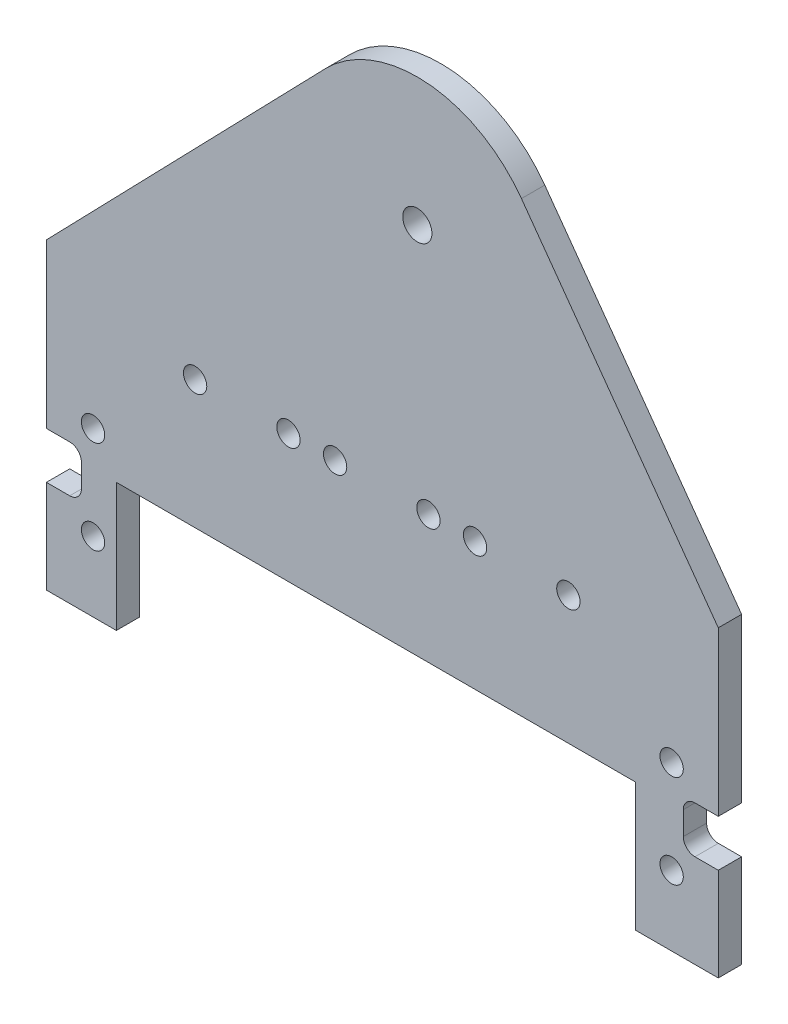
ISO-10303-21;
HEADER;
FILE_DESCRIPTION(('STEP AP214'),'2;1');
FILE_NAME('part.step','',(''),(''),'','','');
FILE_SCHEMA(('AUTOMOTIVE_DESIGN { 1 0 10303 214 1 1 1 1 }'));
ENDSEC;
DATA;
#1=APPLICATION_CONTEXT('core data for automotive mechanical design processes');
#2=APPLICATION_PROTOCOL_DEFINITION('international standard','automotive_design',2000,#1);
#3=PRODUCT_CONTEXT('',#1,'mechanical');
#4=PRODUCT('Part','Part','',(#3));
#5=PRODUCT_RELATED_PRODUCT_CATEGORY('part','',(#4));
#6=PRODUCT_DEFINITION_FORMATION('','',#4);
#7=PRODUCT_DEFINITION_CONTEXT('part definition',#1,'design');
#8=PRODUCT_DEFINITION('design','',#6,#7);
#9=PRODUCT_DEFINITION_SHAPE('','',#8);
#10=(LENGTH_UNIT() NAMED_UNIT(*) SI_UNIT(.MILLI.,.METRE.));
#11=(NAMED_UNIT(*) PLANE_ANGLE_UNIT() SI_UNIT($,.RADIAN.));
#12=(NAMED_UNIT(*) SI_UNIT($,.STERADIAN.) SOLID_ANGLE_UNIT());
#13=UNCERTAINTY_MEASURE_WITH_UNIT(LENGTH_MEASURE(1.E-05),#10,'distance_accuracy_value','');
#14=(GEOMETRIC_REPRESENTATION_CONTEXT(3) GLOBAL_UNCERTAINTY_ASSIGNED_CONTEXT((#13)) GLOBAL_UNIT_ASSIGNED_CONTEXT((#10,
#11,#12)) REPRESENTATION_CONTEXT('',''));
#15=CARTESIAN_POINT('',(0.,0.,0.));
#16=DIRECTION('',(0.,0.,1.));
#17=DIRECTION('',(1.,0.,0.));
#18=AXIS2_PLACEMENT_3D('',#15,#16,#17);
#19=CARTESIAN_POINT('',(-29.8,-32.,2.));
#20=DIRECTION('',(0.,0.,-1.));
#21=DIRECTION('',(-1.,0.,0.));
#22=AXIS2_PLACEMENT_3D('',#19,#20,#21);
#23=PLANE('',#22);
#24=DIRECTION('',(0.,-1.,0.));
#25=VECTOR('',#24,1.);
#26=CARTESIAN_POINT('',(-31.8,-18.,2.));
#27=LINE('',#26,#25);
#28=CARTESIAN_POINT('',(-31.8,-17.,2.));
#29=VERTEX_POINT('',#28);
#30=CARTESIAN_POINT('',(-31.8,-31.,2.));
#31=VERTEX_POINT('',#30);
#32=EDGE_CURVE('E49',#29,#31,#27,.T.);
#33=ORIENTED_EDGE('',*,*,#32,.T.);
#34=DIRECTION('',(1.,0.,0.));
#35=VECTOR('',#34,1.);
#36=CARTESIAN_POINT('',(-31.8,-31.,2.));
#37=LINE('',#36,#35);
#38=CARTESIAN_POINT('',(-29.8,-31.,2.));
#39=VERTEX_POINT('',#38);
#40=EDGE_CURVE('E135',#31,#39,#37,.T.);
#41=ORIENTED_EDGE('',*,*,#40,.T.);
#42=CARTESIAN_POINT('',(-29.8,-32.,2.));
#43=DIRECTION('',(0.,0.,-1.));
#44=DIRECTION('',(-1.,0.,0.));
#45=AXIS2_PLACEMENT_3D('',#42,#43,#44);
#46=CIRCLE('',#45,1.);
#47=CARTESIAN_POINT('',(-28.8,-32.,2.));
#48=VERTEX_POINT('',#47);
#49=EDGE_CURVE('E320',#39,#48,#46,.T.);
#50=ORIENTED_EDGE('',*,*,#49,.T.);
#51=DIRECTION('',(0.,-1.,0.));
#52=VECTOR('',#51,1.);
#53=CARTESIAN_POINT('',(-28.8,-32.,2.));
#54=LINE('',#53,#52);
#55=CARTESIAN_POINT('',(-28.8,-34.,2.));
#56=VERTEX_POINT('',#55);
#57=EDGE_CURVE('E340',#48,#56,#54,.T.);
#58=ORIENTED_EDGE('',*,*,#57,.T.);
#59=CARTESIAN_POINT('',(-29.8,-34.,2.));
#60=DIRECTION('',(0.,0.,-1.));
#61=DIRECTION('',(-1.,0.,0.));
#62=AXIS2_PLACEMENT_3D('',#59,#60,#61);
#63=CIRCLE('',#62,1.);
#64=CARTESIAN_POINT('',(-29.8,-35.,2.));
#65=VERTEX_POINT('',#64);
#66=EDGE_CURVE('E337',#56,#65,#63,.T.);
#67=ORIENTED_EDGE('',*,*,#66,.T.);
#68=DIRECTION('',(-1.,0.,0.));
#69=VECTOR('',#68,1.);
#70=CARTESIAN_POINT('',(-31.8,-35.,2.));
#71=LINE('',#70,#69);
#72=CARTESIAN_POINT('',(-31.8,-35.,2.));
#73=VERTEX_POINT('',#72);
#74=EDGE_CURVE('E339',#65,#73,#71,.T.);
#75=ORIENTED_EDGE('',*,*,#74,.T.);
#76=DIRECTION('',(0.,-1.,0.));
#77=VECTOR('',#76,1.);
#78=CARTESIAN_POINT('',(-31.8,-35.,2.));
#79=LINE('',#78,#77);
#80=CARTESIAN_POINT('',(-31.8,-43.,2.));
#81=VERTEX_POINT('',#80);
#82=EDGE_CURVE('E342',#73,#81,#79,.T.);
#83=ORIENTED_EDGE('',*,*,#82,.T.);
#84=DIRECTION('',(1.,0.,0.));
#85=VECTOR('',#84,1.);
#86=CARTESIAN_POINT('',(-31.8,-43.,2.));
#87=LINE('',#86,#85);
#88=CARTESIAN_POINT('',(-25.8,-43.,2.));
#89=VERTEX_POINT('',#88);
#90=EDGE_CURVE('E348',#81,#89,#87,.T.);
#91=ORIENTED_EDGE('',*,*,#90,.T.);
#92=DIRECTION('',(0.,1.,0.));
#93=VECTOR('',#92,1.);
#94=CARTESIAN_POINT('',(-25.8,-32.,2.));
#95=LINE('',#94,#93);
#96=CARTESIAN_POINT('',(-25.8,-32.,2.));
#97=VERTEX_POINT('',#96);
#98=EDGE_CURVE('E350',#89,#97,#95,.T.);
#99=ORIENTED_EDGE('',*,*,#98,.T.);
#100=DIRECTION('',(1.,0.,0.));
#101=VECTOR('',#100,1.);
#102=CARTESIAN_POINT('',(-25.8,-32.,2.));
#103=LINE('',#102,#101);
#104=CARTESIAN_POINT('',(18.7,-32.,2.));
#105=VERTEX_POINT('',#104);
#106=EDGE_CURVE('E352',#97,#105,#103,.T.);
#107=ORIENTED_EDGE('',*,*,#106,.T.);
#108=DIRECTION('',(0.,-1.,0.));
#109=VECTOR('',#108,1.);
#110=CARTESIAN_POINT('',(18.7,-43.,2.));
#111=LINE('',#110,#109);
#112=CARTESIAN_POINT('',(18.7,-43.,2.));
#113=VERTEX_POINT('',#112);
#114=EDGE_CURVE('E354',#105,#113,#111,.T.);
#115=ORIENTED_EDGE('',*,*,#114,.T.);
#116=DIRECTION('',(1.,0.,0.));
#117=VECTOR('',#116,1.);
#118=CARTESIAN_POINT('',(18.7,-43.,2.));
#119=LINE('',#118,#117);
#120=CARTESIAN_POINT('',(25.8,-43.,2.));
#121=VERTEX_POINT('',#120);
#122=EDGE_CURVE('E356',#113,#121,#119,.T.);
#123=ORIENTED_EDGE('',*,*,#122,.T.);
#124=DIRECTION('',(0.,1.,0.));
#125=VECTOR('',#124,1.);
#126=CARTESIAN_POINT('',(25.8,-42.,2.));
#127=LINE('',#126,#125);
#128=CARTESIAN_POINT('',(25.8,-35.,2.));
#129=VERTEX_POINT('',#128);
#130=EDGE_CURVE('E358',#121,#129,#127,.T.);
#131=ORIENTED_EDGE('',*,*,#130,.T.);
#132=DIRECTION('',(-1.,0.,0.));
#133=VECTOR('',#132,1.);
#134=CARTESIAN_POINT('',(25.8,-35.,2.));
#135=LINE('',#134,#133);
#136=CARTESIAN_POINT('',(23.8,-35.,2.));
#137=VERTEX_POINT('',#136);
#138=EDGE_CURVE('E360',#129,#137,#135,.T.);
#139=ORIENTED_EDGE('',*,*,#138,.T.);
#140=CARTESIAN_POINT('',(23.8,-34.,2.));
#141=DIRECTION('',(0.,0.,-1.));
#142=DIRECTION('',(1.,0.,0.));
#143=AXIS2_PLACEMENT_3D('',#140,#141,#142);
#144=CIRCLE('',#143,1.);
#145=CARTESIAN_POINT('',(22.8,-34.,2.));
#146=VERTEX_POINT('',#145);
#147=EDGE_CURVE('E362',#137,#146,#144,.T.);
#148=ORIENTED_EDGE('',*,*,#147,.T.);
#149=DIRECTION('',(0.,1.,0.));
#150=VECTOR('',#149,1.);
#151=CARTESIAN_POINT('',(22.8,-32.,2.));
#152=LINE('',#151,#150);
#153=CARTESIAN_POINT('',(22.8,-32.,2.));
#154=VERTEX_POINT('',#153);
#155=EDGE_CURVE('E364',#146,#154,#152,.T.);
#156=ORIENTED_EDGE('',*,*,#155,.T.);
#157=CARTESIAN_POINT('',(23.8,-32.,2.));
#158=DIRECTION('',(0.,0.,-1.));
#159=DIRECTION('',(1.,0.,0.));
#160=AXIS2_PLACEMENT_3D('',#157,#158,#159);
#161=CIRCLE('',#160,1.);
#162=CARTESIAN_POINT('',(23.8,-31.,2.));
#163=VERTEX_POINT('',#162);
#164=EDGE_CURVE('E366',#154,#163,#161,.T.);
#165=ORIENTED_EDGE('',*,*,#164,.T.);
#166=DIRECTION('',(1.,0.,0.));
#167=VECTOR('',#166,1.);
#168=CARTESIAN_POINT('',(25.8,-31.,2.));
#169=LINE('',#168,#167);
#170=CARTESIAN_POINT('',(25.8,-31.,2.));
#171=VERTEX_POINT('',#170);
#172=EDGE_CURVE('E368',#163,#171,#169,.T.);
#173=ORIENTED_EDGE('',*,*,#172,.T.);
#174=DIRECTION('',(0.,1.,0.));
#175=VECTOR('',#174,1.);
#176=CARTESIAN_POINT('',(25.8,-18.,2.));
#177=LINE('',#176,#175);
#178=CARTESIAN_POINT('',(25.8,-17.,2.));
#179=VERTEX_POINT('',#178);
#180=EDGE_CURVE('E197',#171,#179,#177,.T.);
#181=ORIENTED_EDGE('',*,*,#180,.T.);
#182=DIRECTION('',(-0.584428553705234,0.811445171046084,0.));
#183=VECTOR('',#182,1.);
#184=CARTESIAN_POINT('',(25.8,-17.,2.));
#185=LINE('',#184,#183);
#186=CARTESIAN_POINT('',(8.92589688150692,6.42871409075757,2.));
#187=VERTEX_POINT('',#186);
#188=EDGE_CURVE('E191',#179,#187,#185,.T.);
#189=ORIENTED_EDGE('',*,*,#188,.T.);
#190=CARTESIAN_POINT('',(0.,0.,2.));
#191=DIRECTION('',(0.,0.,1.));
#192=DIRECTION('',(1.,0.,0.));
#193=AXIS2_PLACEMENT_3D('',#190,#191,#192);
#194=CIRCLE('',#193,11.);
#195=CARTESIAN_POINT('',(-7.89807418644776,7.65639759582582,2.));
#196=VERTEX_POINT('',#195);
#197=EDGE_CURVE('E195',#187,#196,#194,.T.);
#198=ORIENTED_EDGE('',*,*,#197,.T.);
#199=DIRECTION('',(-0.696036145075075,-0.718006744222524,0.));
#200=VECTOR('',#199,1.);
#201=CARTESIAN_POINT('',(-31.8,-17.,2.));
#202=LINE('',#201,#200);
#203=EDGE_CURVE('E211',#196,#29,#202,.T.);
#204=ORIENTED_EDGE('',*,*,#203,.T.);
#205=EDGE_LOOP('',(#33,#41,#50,#58,#67,#75,#83,#91,#99,#107,#115,#123,#131,#139,#148,#156,#165,
#173,#181,#189,#198,#204));
#206=FACE_BOUND('',#205,.T.);
#207=CARTESIAN_POINT('',(0.,0.,2.));
#208=DIRECTION('',(0.,0.,1.));
#209=DIRECTION('',(1.,0.,0.));
#210=AXIS2_PLACEMENT_3D('',#207,#208,#209);
#211=CIRCLE('',#210,1.25);
#212=CARTESIAN_POINT('',(1.25,0.,2.));
#213=VERTEX_POINT('',#212);
#214=EDGE_CURVE('E220',#213,#213,#211,.T.);
#215=ORIENTED_EDGE('',*,*,#214,.F.);
#216=EDGE_LOOP('',(#215));
#217=FACE_BOUND('',#216,.T.);
#218=CARTESIAN_POINT('',(-19.05,-21.,2.));
#219=DIRECTION('',(0.,0.,1.));
#220=DIRECTION('',(1.,0.,0.));
#221=AXIS2_PLACEMENT_3D('',#218,#219,#220);
#222=CIRCLE('',#221,1.);
#223=CARTESIAN_POINT('',(-18.05,-21.,2.));
#224=VERTEX_POINT('',#223);
#225=EDGE_CURVE('E386',#224,#224,#222,.T.);
#226=ORIENTED_EDGE('',*,*,#225,.F.);
#227=EDGE_LOOP('',(#226));
#228=FACE_BOUND('',#227,.T.);
#229=CARTESIAN_POINT('',(-27.8,-29.,2.));
#230=DIRECTION('',(0.,0.,1.));
#231=DIRECTION('',(1.,0.,0.));
#232=AXIS2_PLACEMENT_3D('',#229,#230,#231);
#233=CIRCLE('',#232,1.);
#234=CARTESIAN_POINT('',(-26.8,-29.,2.));
#235=VERTEX_POINT('',#234);
#236=EDGE_CURVE('E392',#235,#235,#233,.T.);
#237=ORIENTED_EDGE('',*,*,#236,.F.);
#238=EDGE_LOOP('',(#237));
#239=FACE_BOUND('',#238,.T.);
#240=CARTESIAN_POINT('',(-27.8,-37.,2.));
#241=DIRECTION('',(0.,0.,1.));
#242=DIRECTION('',(1.,0.,0.));
#243=AXIS2_PLACEMENT_3D('',#240,#241,#242);
#244=CIRCLE('',#243,1.);
#245=CARTESIAN_POINT('',(-26.8,-37.,2.));
#246=VERTEX_POINT('',#245);
#247=EDGE_CURVE('E398',#246,#246,#244,.T.);
#248=ORIENTED_EDGE('',*,*,#247,.F.);
#249=EDGE_LOOP('',(#248));
#250=FACE_BOUND('',#249,.T.);
#251=CARTESIAN_POINT('',(21.8000000000001,-37.,2.));
#252=DIRECTION('',(0.,0.,1.));
#253=DIRECTION('',(-1.,0.,0.));
#254=AXIS2_PLACEMENT_3D('',#251,#252,#253);
#255=CIRCLE('',#254,1.00000000000001);
#256=CARTESIAN_POINT('',(20.8000000000001,-37.,2.));
#257=VERTEX_POINT('',#256);
#258=EDGE_CURVE('E404',#257,#257,#255,.T.);
#259=ORIENTED_EDGE('',*,*,#258,.F.);
#260=EDGE_LOOP('',(#259));
#261=FACE_BOUND('',#260,.T.);
#262=CARTESIAN_POINT('',(21.8,-29.,2.));
#263=DIRECTION('',(0.,0.,1.));
#264=DIRECTION('',(-1.,0.,0.));
#265=AXIS2_PLACEMENT_3D('',#262,#263,#264);
#266=CIRCLE('',#265,1.00000000000001);
#267=CARTESIAN_POINT('',(20.8,-29.,2.));
#268=VERTEX_POINT('',#267);
#269=EDGE_CURVE('E410',#268,#268,#266,.T.);
#270=ORIENTED_EDGE('',*,*,#269,.F.);
#271=EDGE_LOOP('',(#270));
#272=FACE_BOUND('',#271,.T.);
#273=CARTESIAN_POINT('',(-11.05,-21.,2.));
#274=DIRECTION('',(0.,0.,1.));
#275=DIRECTION('',(1.,0.,0.));
#276=AXIS2_PLACEMENT_3D('',#273,#274,#275);
#277=CIRCLE('',#276,1.);
#278=CARTESIAN_POINT('',(-10.05,-21.,2.));
#279=VERTEX_POINT('',#278);
#280=EDGE_CURVE('E416',#279,#279,#277,.T.);
#281=ORIENTED_EDGE('',*,*,#280,.F.);
#282=EDGE_LOOP('',(#281));
#283=FACE_BOUND('',#282,.T.);
#284=CARTESIAN_POINT('',(4.94999999999999,-21.,2.));
#285=DIRECTION('',(0.,0.,1.));
#286=DIRECTION('',(1.,0.,0.));
#287=AXIS2_PLACEMENT_3D('',#284,#285,#286);
#288=CIRCLE('',#287,1.);
#289=CARTESIAN_POINT('',(5.94999999999999,-21.,2.));
#290=VERTEX_POINT('',#289);
#291=EDGE_CURVE('E422',#290,#290,#288,.T.);
#292=ORIENTED_EDGE('',*,*,#291,.F.);
#293=EDGE_LOOP('',(#292));
#294=FACE_BOUND('',#293,.T.);
#295=CARTESIAN_POINT('',(12.95,-21.,2.));
#296=DIRECTION('',(0.,0.,1.));
#297=DIRECTION('',(1.,0.,0.));
#298=AXIS2_PLACEMENT_3D('',#295,#296,#297);
#299=CIRCLE('',#298,1.);
#300=CARTESIAN_POINT('',(13.95,-21.,2.));
#301=VERTEX_POINT('',#300);
#302=EDGE_CURVE('E428',#301,#301,#299,.T.);
#303=ORIENTED_EDGE('',*,*,#302,.F.);
#304=EDGE_LOOP('',(#303));
#305=FACE_BOUND('',#304,.T.);
#306=CARTESIAN_POINT('',(-7.05,-21.,2.));
#307=DIRECTION('',(0.,0.,1.));
#308=DIRECTION('',(1.,0.,0.));
#309=AXIS2_PLACEMENT_3D('',#306,#307,#308);
#310=CIRCLE('',#309,1.);
#311=CARTESIAN_POINT('',(-6.05,-21.,2.));
#312=VERTEX_POINT('',#311);
#313=EDGE_CURVE('E434',#312,#312,#310,.T.);
#314=ORIENTED_EDGE('',*,*,#313,.F.);
#315=EDGE_LOOP('',(#314));
#316=FACE_BOUND('',#315,.T.);
#317=CARTESIAN_POINT('',(0.950000000000002,-21.,2.));
#318=DIRECTION('',(0.,0.,1.));
#319=DIRECTION('',(1.,0.,0.));
#320=AXIS2_PLACEMENT_3D('',#317,#318,#319);
#321=CIRCLE('',#320,1.);
#322=CARTESIAN_POINT('',(1.95,-21.,2.));
#323=VERTEX_POINT('',#322);
#324=EDGE_CURVE('E440',#323,#323,#321,.T.);
#325=ORIENTED_EDGE('',*,*,#324,.F.);
#326=EDGE_LOOP('',(#325));
#327=FACE_BOUND('',#326,.T.);
#328=ADVANCED_FACE('F32',(#206,#217,#228,#239,#250,#261,#272,#283,#294,#305,#316,#327),#23,.F.);
#329=CARTESIAN_POINT('',(-29.8,-32.,0.));
#330=DIRECTION('',(0.,0.,-1.));
#331=DIRECTION('',(-1.,0.,0.));
#332=AXIS2_PLACEMENT_3D('',#329,#330,#331);
#333=PLANE('',#332);
#334=CARTESIAN_POINT('',(-7.05,-21.,0.));
#335=DIRECTION('',(0.,0.,1.));
#336=DIRECTION('',(1.,0.,0.));
#337=AXIS2_PLACEMENT_3D('',#334,#335,#336);
#338=CIRCLE('',#337,1.);
#339=CARTESIAN_POINT('',(-6.05,-21.,0.));
#340=VERTEX_POINT('',#339);
#341=EDGE_CURVE('E437',#340,#340,#338,.T.);
#342=ORIENTED_EDGE('',*,*,#341,.T.);
#343=EDGE_LOOP('',(#342));
#344=FACE_BOUND('',#343,.T.);
#345=CARTESIAN_POINT('',(4.94999999999999,-21.,0.));
#346=DIRECTION('',(0.,0.,1.));
#347=DIRECTION('',(1.,0.,0.));
#348=AXIS2_PLACEMENT_3D('',#345,#346,#347);
#349=CIRCLE('',#348,1.);
#350=CARTESIAN_POINT('',(5.94999999999999,-21.,0.));
#351=VERTEX_POINT('',#350);
#352=EDGE_CURVE('E425',#351,#351,#349,.T.);
#353=ORIENTED_EDGE('',*,*,#352,.T.);
#354=EDGE_LOOP('',(#353));
#355=FACE_BOUND('',#354,.T.);
#356=CARTESIAN_POINT('',(21.8,-29.,0.));
#357=DIRECTION('',(0.,0.,1.));
#358=DIRECTION('',(-1.,0.,0.));
#359=AXIS2_PLACEMENT_3D('',#356,#357,#358);
#360=CIRCLE('',#359,1.00000000000001);
#361=CARTESIAN_POINT('',(20.8,-29.,0.));
#362=VERTEX_POINT('',#361);
#363=EDGE_CURVE('E413',#362,#362,#360,.T.);
#364=ORIENTED_EDGE('',*,*,#363,.T.);
#365=EDGE_LOOP('',(#364));
#366=FACE_BOUND('',#365,.T.);
#367=CARTESIAN_POINT('',(-27.8,-37.,0.));
#368=DIRECTION('',(0.,0.,1.));
#369=DIRECTION('',(1.,0.,0.));
#370=AXIS2_PLACEMENT_3D('',#367,#368,#369);
#371=CIRCLE('',#370,1.);
#372=CARTESIAN_POINT('',(-26.8,-37.,0.));
#373=VERTEX_POINT('',#372);
#374=EDGE_CURVE('E401',#373,#373,#371,.T.);
#375=ORIENTED_EDGE('',*,*,#374,.T.);
#376=EDGE_LOOP('',(#375));
#377=FACE_BOUND('',#376,.T.);
#378=CARTESIAN_POINT('',(-19.05,-21.,0.));
#379=DIRECTION('',(0.,0.,1.));
#380=DIRECTION('',(1.,0.,0.));
#381=AXIS2_PLACEMENT_3D('',#378,#379,#380);
#382=CIRCLE('',#381,1.);
#383=CARTESIAN_POINT('',(-18.05,-21.,0.));
#384=VERTEX_POINT('',#383);
#385=EDGE_CURVE('E389',#384,#384,#382,.T.);
#386=ORIENTED_EDGE('',*,*,#385,.T.);
#387=EDGE_LOOP('',(#386));
#388=FACE_BOUND('',#387,.T.);
#389=DIRECTION('',(1.,0.,0.));
#390=VECTOR('',#389,1.);
#391=CARTESIAN_POINT('',(-31.8,-31.,0.));
#392=LINE('',#391,#390);
#393=CARTESIAN_POINT('',(-31.8,-31.,0.));
#394=VERTEX_POINT('',#393);
#395=CARTESIAN_POINT('',(-29.8,-31.,0.));
#396=VERTEX_POINT('',#395);
#397=EDGE_CURVE('E217',#394,#396,#392,.T.);
#398=ORIENTED_EDGE('',*,*,#397,.F.);
#399=DIRECTION('',(0.,-1.,0.));
#400=VECTOR('',#399,1.);
#401=CARTESIAN_POINT('',(-31.8,-18.,0.));
#402=LINE('',#401,#400);
#403=CARTESIAN_POINT('',(-31.8,-17.,0.));
#404=VERTEX_POINT('',#403);
#405=EDGE_CURVE('E262',#404,#394,#402,.T.);
#406=ORIENTED_EDGE('',*,*,#405,.F.);
#407=DIRECTION('',(-0.696036145075075,-0.718006744222524,0.));
#408=VECTOR('',#407,1.);
#409=CARTESIAN_POINT('',(-31.8,-17.,0.));
#410=LINE('',#409,#408);
#411=CARTESIAN_POINT('',(-7.89807418644776,7.65639759582582,0.));
#412=VERTEX_POINT('',#411);
#413=EDGE_CURVE('E128',#412,#404,#410,.T.);
#414=ORIENTED_EDGE('',*,*,#413,.F.);
#415=CARTESIAN_POINT('',(0.,0.,0.));
#416=DIRECTION('',(0.,0.,1.));
#417=DIRECTION('',(1.,0.,0.));
#418=AXIS2_PLACEMENT_3D('',#415,#416,#417);
#419=CIRCLE('',#418,11.);
#420=CARTESIAN_POINT('',(8.92589688150692,6.42871409075757,0.));
#421=VERTEX_POINT('',#420);
#422=EDGE_CURVE('E121',#421,#412,#419,.T.);
#423=ORIENTED_EDGE('',*,*,#422,.F.);
#424=DIRECTION('',(-0.584428553705234,0.811445171046084,0.));
#425=VECTOR('',#424,1.);
#426=CARTESIAN_POINT('',(25.8,-17.,0.));
#427=LINE('',#426,#425);
#428=CARTESIAN_POINT('',(25.8,-17.,0.));
#429=VERTEX_POINT('',#428);
#430=EDGE_CURVE('E205',#429,#421,#427,.T.);
#431=ORIENTED_EDGE('',*,*,#430,.F.);
#432=DIRECTION('',(0.,1.,0.));
#433=VECTOR('',#432,1.);
#434=CARTESIAN_POINT('',(25.8,-18.,0.));
#435=LINE('',#434,#433);
#436=CARTESIAN_POINT('',(25.8,-31.,0.));
#437=VERTEX_POINT('',#436);
#438=EDGE_CURVE('E257',#437,#429,#435,.T.);
#439=ORIENTED_EDGE('',*,*,#438,.F.);
#440=DIRECTION('',(1.,0.,0.));
#441=VECTOR('',#440,1.);
#442=CARTESIAN_POINT('',(25.8,-31.,0.));
#443=LINE('',#442,#441);
#444=CARTESIAN_POINT('',(23.8,-31.,0.));
#445=VERTEX_POINT('',#444);
#446=EDGE_CURVE('E254',#445,#437,#443,.T.);
#447=ORIENTED_EDGE('',*,*,#446,.F.);
#448=CARTESIAN_POINT('',(23.8,-32.,0.));
#449=DIRECTION('',(0.,0.,-1.));
#450=DIRECTION('',(1.,0.,0.));
#451=AXIS2_PLACEMENT_3D('',#448,#449,#450);
#452=CIRCLE('',#451,1.);
#453=CARTESIAN_POINT('',(22.8,-32.,0.));
#454=VERTEX_POINT('',#453);
#455=EDGE_CURVE('E252',#454,#445,#452,.T.);
#456=ORIENTED_EDGE('',*,*,#455,.F.);
#457=DIRECTION('',(0.,1.,0.));
#458=VECTOR('',#457,1.);
#459=CARTESIAN_POINT('',(22.8,-32.,0.));
#460=LINE('',#459,#458);
#461=CARTESIAN_POINT('',(22.8,-34.,0.));
#462=VERTEX_POINT('',#461);
#463=EDGE_CURVE('E250',#462,#454,#460,.T.);
#464=ORIENTED_EDGE('',*,*,#463,.F.);
#465=CARTESIAN_POINT('',(23.8,-34.,0.));
#466=DIRECTION('',(0.,0.,-1.));
#467=DIRECTION('',(1.,0.,0.));
#468=AXIS2_PLACEMENT_3D('',#465,#466,#467);
#469=CIRCLE('',#468,1.);
#470=CARTESIAN_POINT('',(23.8,-35.,0.));
#471=VERTEX_POINT('',#470);
#472=EDGE_CURVE('E248',#471,#462,#469,.T.);
#473=ORIENTED_EDGE('',*,*,#472,.F.);
#474=DIRECTION('',(-1.,0.,0.));
#475=VECTOR('',#474,1.);
#476=CARTESIAN_POINT('',(25.8,-35.,0.));
#477=LINE('',#476,#475);
#478=CARTESIAN_POINT('',(25.8,-35.,0.));
#479=VERTEX_POINT('',#478);
#480=EDGE_CURVE('E246',#479,#471,#477,.T.);
#481=ORIENTED_EDGE('',*,*,#480,.F.);
#482=DIRECTION('',(0.,1.,0.));
#483=VECTOR('',#482,1.);
#484=CARTESIAN_POINT('',(25.8,-35.,0.));
#485=LINE('',#484,#483);
#486=CARTESIAN_POINT('',(25.8,-43.,0.));
#487=VERTEX_POINT('',#486);
#488=EDGE_CURVE('E244',#487,#479,#485,.T.);
#489=ORIENTED_EDGE('',*,*,#488,.F.);
#490=DIRECTION('',(1.,0.,0.));
#491=VECTOR('',#490,1.);
#492=CARTESIAN_POINT('',(25.8,-43.,0.));
#493=LINE('',#492,#491);
#494=CARTESIAN_POINT('',(18.7,-43.,0.));
#495=VERTEX_POINT('',#494);
#496=EDGE_CURVE('E241',#495,#487,#493,.T.);
#497=ORIENTED_EDGE('',*,*,#496,.F.);
#498=DIRECTION('',(0.,-1.,0.));
#499=VECTOR('',#498,1.);
#500=CARTESIAN_POINT('',(18.7,-43.,0.));
#501=LINE('',#500,#499);
#502=CARTESIAN_POINT('',(18.7,-32.,0.));
#503=VERTEX_POINT('',#502);
#504=EDGE_CURVE('E238',#503,#495,#501,.T.);
#505=ORIENTED_EDGE('',*,*,#504,.F.);
#506=DIRECTION('',(1.,0.,0.));
#507=VECTOR('',#506,1.);
#508=CARTESIAN_POINT('',(-25.8,-32.,0.));
#509=LINE('',#508,#507);
#510=CARTESIAN_POINT('',(-25.8,-32.,0.));
#511=VERTEX_POINT('',#510);
#512=EDGE_CURVE('E236',#511,#503,#509,.T.);
#513=ORIENTED_EDGE('',*,*,#512,.F.);
#514=DIRECTION('',(0.,1.,0.));
#515=VECTOR('',#514,1.);
#516=CARTESIAN_POINT('',(-25.8,-32.,0.));
#517=LINE('',#516,#515);
#518=CARTESIAN_POINT('',(-25.8,-43.,0.));
#519=VERTEX_POINT('',#518);
#520=EDGE_CURVE('E234',#519,#511,#517,.T.);
#521=ORIENTED_EDGE('',*,*,#520,.F.);
#522=DIRECTION('',(1.,0.,0.));
#523=VECTOR('',#522,1.);
#524=CARTESIAN_POINT('',(-25.8,-43.,0.));
#525=LINE('',#524,#523);
#526=CARTESIAN_POINT('',(-31.8,-43.,0.));
#527=VERTEX_POINT('',#526);
#528=EDGE_CURVE('E232',#527,#519,#525,.T.);
#529=ORIENTED_EDGE('',*,*,#528,.F.);
#530=DIRECTION('',(0.,-1.,0.));
#531=VECTOR('',#530,1.);
#532=CARTESIAN_POINT('',(-31.8,-42.,0.));
#533=LINE('',#532,#531);
#534=CARTESIAN_POINT('',(-31.8,-35.,0.));
#535=VERTEX_POINT('',#534);
#536=EDGE_CURVE('E229',#535,#527,#533,.T.);
#537=ORIENTED_EDGE('',*,*,#536,.F.);
#538=DIRECTION('',(-1.,0.,0.));
#539=VECTOR('',#538,1.);
#540=CARTESIAN_POINT('',(-31.8,-35.,0.));
#541=LINE('',#540,#539);
#542=CARTESIAN_POINT('',(-29.8,-35.,0.));
#543=VERTEX_POINT('',#542);
#544=EDGE_CURVE('E226',#543,#535,#541,.T.);
#545=ORIENTED_EDGE('',*,*,#544,.F.);
#546=CARTESIAN_POINT('',(-29.8,-34.,0.));
#547=DIRECTION('',(0.,0.,-1.));
#548=DIRECTION('',(-1.,0.,0.));
#549=AXIS2_PLACEMENT_3D('',#546,#547,#548);
#550=CIRCLE('',#549,1.);
#551=CARTESIAN_POINT('',(-28.8,-34.,0.));
#552=VERTEX_POINT('',#551);
#553=EDGE_CURVE('E224',#552,#543,#550,.T.);
#554=ORIENTED_EDGE('',*,*,#553,.F.);
#555=DIRECTION('',(0.,-1.,0.));
#556=VECTOR('',#555,1.);
#557=CARTESIAN_POINT('',(-28.8,-32.,0.));
#558=LINE('',#557,#556);
#559=CARTESIAN_POINT('',(-28.8,-32.,0.));
#560=VERTEX_POINT('',#559);
#561=EDGE_CURVE('E222',#560,#552,#558,.T.);
#562=ORIENTED_EDGE('',*,*,#561,.F.);
#563=CARTESIAN_POINT('',(-29.8,-32.,0.));
#564=DIRECTION('',(0.,0.,-1.));
#565=DIRECTION('',(-1.,0.,0.));
#566=AXIS2_PLACEMENT_3D('',#563,#564,#565);
#567=CIRCLE('',#566,1.);
#568=EDGE_CURVE('E219',#396,#560,#567,.T.);
#569=ORIENTED_EDGE('',*,*,#568,.F.);
#570=EDGE_LOOP('',(#398,#406,#414,#423,#431,#439,#447,#456,#464,#473,#481,#489,#497,#505,#513,
#521,#529,#537,#545,#554,#562,#569));
#571=FACE_BOUND('',#570,.T.);
#572=CARTESIAN_POINT('',(0.,0.,0.));
#573=DIRECTION('',(0.,0.,1.));
#574=DIRECTION('',(1.,0.,0.));
#575=AXIS2_PLACEMENT_3D('',#572,#573,#574);
#576=CIRCLE('',#575,1.25);
#577=CARTESIAN_POINT('',(1.25,0.,0.));
#578=VERTEX_POINT('',#577);
#579=EDGE_CURVE('E383',#578,#578,#576,.T.);
#580=ORIENTED_EDGE('',*,*,#579,.T.);
#581=EDGE_LOOP('',(#580));
#582=FACE_BOUND('',#581,.T.);
#583=CARTESIAN_POINT('',(-27.8,-29.,0.));
#584=DIRECTION('',(0.,0.,1.));
#585=DIRECTION('',(1.,0.,0.));
#586=AXIS2_PLACEMENT_3D('',#583,#584,#585);
#587=CIRCLE('',#586,1.);
#588=CARTESIAN_POINT('',(-26.8,-29.,0.));
#589=VERTEX_POINT('',#588);
#590=EDGE_CURVE('E395',#589,#589,#587,.T.);
#591=ORIENTED_EDGE('',*,*,#590,.T.);
#592=EDGE_LOOP('',(#591));
#593=FACE_BOUND('',#592,.T.);
#594=CARTESIAN_POINT('',(21.8000000000001,-37.,0.));
#595=DIRECTION('',(0.,0.,1.));
#596=DIRECTION('',(-1.,0.,0.));
#597=AXIS2_PLACEMENT_3D('',#594,#595,#596);
#598=CIRCLE('',#597,1.00000000000001);
#599=CARTESIAN_POINT('',(20.8000000000001,-37.,0.));
#600=VERTEX_POINT('',#599);
#601=EDGE_CURVE('E407',#600,#600,#598,.T.);
#602=ORIENTED_EDGE('',*,*,#601,.T.);
#603=EDGE_LOOP('',(#602));
#604=FACE_BOUND('',#603,.T.);
#605=CARTESIAN_POINT('',(-11.05,-21.,0.));
#606=DIRECTION('',(0.,0.,1.));
#607=DIRECTION('',(1.,0.,0.));
#608=AXIS2_PLACEMENT_3D('',#605,#606,#607);
#609=CIRCLE('',#608,1.);
#610=CARTESIAN_POINT('',(-10.05,-21.,0.));
#611=VERTEX_POINT('',#610);
#612=EDGE_CURVE('E419',#611,#611,#609,.T.);
#613=ORIENTED_EDGE('',*,*,#612,.T.);
#614=EDGE_LOOP('',(#613));
#615=FACE_BOUND('',#614,.T.);
#616=CARTESIAN_POINT('',(12.95,-21.,0.));
#617=DIRECTION('',(0.,0.,1.));
#618=DIRECTION('',(1.,0.,0.));
#619=AXIS2_PLACEMENT_3D('',#616,#617,#618);
#620=CIRCLE('',#619,1.);
#621=CARTESIAN_POINT('',(13.95,-21.,0.));
#622=VERTEX_POINT('',#621);
#623=EDGE_CURVE('E431',#622,#622,#620,.T.);
#624=ORIENTED_EDGE('',*,*,#623,.T.);
#625=EDGE_LOOP('',(#624));
#626=FACE_BOUND('',#625,.T.);
#627=CARTESIAN_POINT('',(0.950000000000002,-21.,0.));
#628=DIRECTION('',(0.,0.,1.));
#629=DIRECTION('',(1.,0.,0.));
#630=AXIS2_PLACEMENT_3D('',#627,#628,#629);
#631=CIRCLE('',#630,1.);
#632=CARTESIAN_POINT('',(1.95,-21.,0.));
#633=VERTEX_POINT('',#632);
#634=EDGE_CURVE('E443',#633,#633,#631,.T.);
#635=ORIENTED_EDGE('',*,*,#634,.T.);
#636=EDGE_LOOP('',(#635));
#637=FACE_BOUND('',#636,.T.);
#638=ADVANCED_FACE('F324',(#344,#355,#366,#377,#388,#571,#582,#593,#604,#615,#626,#637),#333,.T.);
#639=CARTESIAN_POINT('',(-31.8,-31.,2.));
#640=DIRECTION('',(0.,1.,0.));
#641=DIRECTION('',(0.,0.,1.));
#642=AXIS2_PLACEMENT_3D('',#639,#640,#641);
#643=PLANE('',#642);
#644=ORIENTED_EDGE('',*,*,#397,.T.);
#645=DIRECTION('',(0.,0.,-1.));
#646=VECTOR('',#645,1.);
#647=CARTESIAN_POINT('',(-29.8,-31.,2.));
#648=LINE('',#647,#646);
#649=EDGE_CURVE('E41',#39,#396,#648,.T.);
#650=ORIENTED_EDGE('',*,*,#649,.F.);
#651=ORIENTED_EDGE('',*,*,#40,.F.);
#652=DIRECTION('',(0.,0.,-1.));
#653=VECTOR('',#652,1.);
#654=CARTESIAN_POINT('',(-31.8,-31.,2.));
#655=LINE('',#654,#653);
#656=EDGE_CURVE('E11',#31,#394,#655,.T.);
#657=ORIENTED_EDGE('',*,*,#656,.T.);
#658=EDGE_LOOP('',(#644,#650,#651,#657));
#659=FACE_BOUND('',#658,.T.);
#660=ADVANCED_FACE('F34',(#659),#643,.F.);
#661=CARTESIAN_POINT('',(-29.8,-32.,2.));
#662=DIRECTION('',(0.,0.,-1.));
#663=DIRECTION('',(-1.,0.,0.));
#664=AXIS2_PLACEMENT_3D('',#661,#662,#663);
#665=CYLINDRICAL_SURFACE('',#664,1.);
#666=ORIENTED_EDGE('',*,*,#568,.T.);
#667=DIRECTION('',(0.,0.,-1.));
#668=VECTOR('',#667,1.);
#669=CARTESIAN_POINT('',(-28.8,-32.,2.));
#670=LINE('',#669,#668);
#671=EDGE_CURVE('E312',#48,#560,#670,.T.);
#672=ORIENTED_EDGE('',*,*,#671,.F.);
#673=ORIENTED_EDGE('',*,*,#49,.F.);
#674=ORIENTED_EDGE('',*,*,#649,.T.);
#675=EDGE_LOOP('',(#666,#672,#673,#674));
#676=FACE_BOUND('',#675,.T.);
#677=ADVANCED_FACE('F318',(#676),#665,.F.);
#678=CARTESIAN_POINT('',(-28.8,-32.,2.));
#679=DIRECTION('',(1.,0.,0.));
#680=DIRECTION('',(0.,0.,-1.));
#681=AXIS2_PLACEMENT_3D('',#678,#679,#680);
#682=PLANE('',#681);
#683=ORIENTED_EDGE('',*,*,#561,.T.);
#684=DIRECTION('',(0.,0.,-1.));
#685=VECTOR('',#684,1.);
#686=CARTESIAN_POINT('',(-28.8,-34.,2.));
#687=LINE('',#686,#685);
#688=EDGE_CURVE('E309',#56,#552,#687,.T.);
#689=ORIENTED_EDGE('',*,*,#688,.F.);
#690=ORIENTED_EDGE('',*,*,#57,.F.);
#691=ORIENTED_EDGE('',*,*,#671,.T.);
#692=EDGE_LOOP('',(#683,#689,#690,#691));
#693=FACE_BOUND('',#692,.T.);
#694=ADVANCED_FACE('F331',(#693),#682,.F.);
#695=CARTESIAN_POINT('',(-29.8,-34.,2.));
#696=DIRECTION('',(0.,0.,-1.));
#697=DIRECTION('',(-1.,0.,0.));
#698=AXIS2_PLACEMENT_3D('',#695,#696,#697);
#699=CYLINDRICAL_SURFACE('',#698,1.);
#700=ORIENTED_EDGE('',*,*,#553,.T.);
#701=DIRECTION('',(0.,0.,-1.));
#702=VECTOR('',#701,1.);
#703=CARTESIAN_POINT('',(-29.8,-35.,2.));
#704=LINE('',#703,#702);
#705=EDGE_CURVE('E306',#65,#543,#704,.T.);
#706=ORIENTED_EDGE('',*,*,#705,.F.);
#707=ORIENTED_EDGE('',*,*,#66,.F.);
#708=ORIENTED_EDGE('',*,*,#688,.T.);
#709=EDGE_LOOP('',(#700,#706,#707,#708));
#710=FACE_BOUND('',#709,.T.);
#711=ADVANCED_FACE('F335',(#710),#699,.F.);
#712=CARTESIAN_POINT('',(-31.8,-35.,2.));
#713=DIRECTION('',(0.,-1.,0.));
#714=DIRECTION('',(0.,0.,-1.));
#715=AXIS2_PLACEMENT_3D('',#712,#713,#714);
#716=PLANE('',#715);
#717=ORIENTED_EDGE('',*,*,#544,.T.);
#718=DIRECTION('',(0.,0.,-1.));
#719=VECTOR('',#718,1.);
#720=CARTESIAN_POINT('',(-31.8,-35.,2.));
#721=LINE('',#720,#719);
#722=EDGE_CURVE('E303',#73,#535,#721,.T.);
#723=ORIENTED_EDGE('',*,*,#722,.F.);
#724=ORIENTED_EDGE('',*,*,#74,.F.);
#725=ORIENTED_EDGE('',*,*,#705,.T.);
#726=EDGE_LOOP('',(#717,#723,#724,#725));
#727=FACE_BOUND('',#726,.T.);
#728=ADVANCED_FACE('F518',(#727),#716,.F.);
#729=CARTESIAN_POINT('',(-31.8,-42.,2.));
#730=DIRECTION('',(1.,0.,0.));
#731=DIRECTION('',(0.,0.,-1.));
#732=AXIS2_PLACEMENT_3D('',#729,#730,#731);
#733=PLANE('',#732);
#734=ORIENTED_EDGE('',*,*,#536,.T.);
#735=DIRECTION('',(0.,0.,-1.));
#736=VECTOR('',#735,1.);
#737=CARTESIAN_POINT('',(-31.8,-43.,2.));
#738=LINE('',#737,#736);
#739=EDGE_CURVE('E300',#81,#527,#738,.T.);
#740=ORIENTED_EDGE('',*,*,#739,.F.);
#741=ORIENTED_EDGE('',*,*,#82,.F.);
#742=ORIENTED_EDGE('',*,*,#722,.T.);
#743=EDGE_LOOP('',(#734,#740,#741,#742));
#744=FACE_BOUND('',#743,.T.);
#745=ADVANCED_FACE('F514',(#744),#733,.F.);
#746=CARTESIAN_POINT('',(-25.8,-43.,2.));
#747=DIRECTION('',(0.,1.,0.));
#748=DIRECTION('',(0.,0.,1.));
#749=AXIS2_PLACEMENT_3D('',#746,#747,#748);
#750=PLANE('',#749);
#751=ORIENTED_EDGE('',*,*,#528,.T.);
#752=DIRECTION('',(0.,0.,-1.));
#753=VECTOR('',#752,1.);
#754=CARTESIAN_POINT('',(-25.8,-43.,2.));
#755=LINE('',#754,#753);
#756=EDGE_CURVE('E297',#89,#519,#755,.T.);
#757=ORIENTED_EDGE('',*,*,#756,.F.);
#758=ORIENTED_EDGE('',*,*,#90,.F.);
#759=ORIENTED_EDGE('',*,*,#739,.T.);
#760=EDGE_LOOP('',(#751,#757,#758,#759));
#761=FACE_BOUND('',#760,.T.);
#762=ADVANCED_FACE('F510',(#761),#750,.F.);
#763=CARTESIAN_POINT('',(-25.8,-32.,2.));
#764=DIRECTION('',(-1.,0.,0.));
#765=DIRECTION('',(0.,0.,1.));
#766=AXIS2_PLACEMENT_3D('',#763,#764,#765);
#767=PLANE('',#766);
#768=ORIENTED_EDGE('',*,*,#520,.T.);
#769=DIRECTION('',(0.,0.,-1.));
#770=VECTOR('',#769,1.);
#771=CARTESIAN_POINT('',(-25.8,-32.,2.));
#772=LINE('',#771,#770);
#773=EDGE_CURVE('E294',#97,#511,#772,.T.);
#774=ORIENTED_EDGE('',*,*,#773,.F.);
#775=ORIENTED_EDGE('',*,*,#98,.F.);
#776=ORIENTED_EDGE('',*,*,#756,.T.);
#777=EDGE_LOOP('',(#768,#774,#775,#776));
#778=FACE_BOUND('',#777,.T.);
#779=ADVANCED_FACE('F506',(#778),#767,.F.);
#780=CARTESIAN_POINT('',(-25.8,-32.,2.));
#781=DIRECTION('',(0.,1.,0.));
#782=DIRECTION('',(0.,0.,1.));
#783=AXIS2_PLACEMENT_3D('',#780,#781,#782);
#784=PLANE('',#783);
#785=ORIENTED_EDGE('',*,*,#512,.T.);
#786=DIRECTION('',(0.,0.,-1.));
#787=VECTOR('',#786,1.);
#788=CARTESIAN_POINT('',(18.7,-32.,2.));
#789=LINE('',#788,#787);
#790=EDGE_CURVE('E291',#105,#503,#789,.T.);
#791=ORIENTED_EDGE('',*,*,#790,.F.);
#792=ORIENTED_EDGE('',*,*,#106,.F.);
#793=ORIENTED_EDGE('',*,*,#773,.T.);
#794=EDGE_LOOP('',(#785,#791,#792,#793));
#795=FACE_BOUND('',#794,.T.);
#796=ADVANCED_FACE('F502',(#795),#784,.F.);
#797=CARTESIAN_POINT('',(18.7,-43.,2.));
#798=DIRECTION('',(1.,0.,0.));
#799=DIRECTION('',(0.,0.,-1.));
#800=AXIS2_PLACEMENT_3D('',#797,#798,#799);
#801=PLANE('',#800);
#802=ORIENTED_EDGE('',*,*,#504,.T.);
#803=DIRECTION('',(0.,0.,-1.));
#804=VECTOR('',#803,1.);
#805=CARTESIAN_POINT('',(18.7,-43.,2.));
#806=LINE('',#805,#804);
#807=EDGE_CURVE('E288',#113,#495,#806,.T.);
#808=ORIENTED_EDGE('',*,*,#807,.F.);
#809=ORIENTED_EDGE('',*,*,#114,.F.);
#810=ORIENTED_EDGE('',*,*,#790,.T.);
#811=EDGE_LOOP('',(#802,#808,#809,#810));
#812=FACE_BOUND('',#811,.T.);
#813=ADVANCED_FACE('F498',(#812),#801,.F.);
#814=CARTESIAN_POINT('',(25.8,-43.,2.));
#815=DIRECTION('',(0.,1.,0.));
#816=DIRECTION('',(0.,0.,1.));
#817=AXIS2_PLACEMENT_3D('',#814,#815,#816);
#818=PLANE('',#817);
#819=ORIENTED_EDGE('',*,*,#496,.T.);
#820=DIRECTION('',(0.,0.,-1.));
#821=VECTOR('',#820,1.);
#822=CARTESIAN_POINT('',(25.8,-43.,2.));
#823=LINE('',#822,#821);
#824=EDGE_CURVE('E285',#121,#487,#823,.T.);
#825=ORIENTED_EDGE('',*,*,#824,.F.);
#826=ORIENTED_EDGE('',*,*,#122,.F.);
#827=ORIENTED_EDGE('',*,*,#807,.T.);
#828=EDGE_LOOP('',(#819,#825,#826,#827));
#829=FACE_BOUND('',#828,.T.);
#830=ADVANCED_FACE('F494',(#829),#818,.F.);
#831=CARTESIAN_POINT('',(25.8,-35.,2.));
#832=DIRECTION('',(-1.,0.,0.));
#833=DIRECTION('',(0.,0.,1.));
#834=AXIS2_PLACEMENT_3D('',#831,#832,#833);
#835=PLANE('',#834);
#836=ORIENTED_EDGE('',*,*,#488,.T.);
#837=DIRECTION('',(0.,0.,-1.));
#838=VECTOR('',#837,1.);
#839=CARTESIAN_POINT('',(25.8,-35.,2.));
#840=LINE('',#839,#838);
#841=EDGE_CURVE('E282',#129,#479,#840,.T.);
#842=ORIENTED_EDGE('',*,*,#841,.F.);
#843=ORIENTED_EDGE('',*,*,#130,.F.);
#844=ORIENTED_EDGE('',*,*,#824,.T.);
#845=EDGE_LOOP('',(#836,#842,#843,#844));
#846=FACE_BOUND('',#845,.T.);
#847=ADVANCED_FACE('F490',(#846),#835,.F.);
#848=CARTESIAN_POINT('',(25.8,-35.,2.));
#849=DIRECTION('',(0.,-1.,0.));
#850=DIRECTION('',(0.,0.,-1.));
#851=AXIS2_PLACEMENT_3D('',#848,#849,#850);
#852=PLANE('',#851);
#853=ORIENTED_EDGE('',*,*,#480,.T.);
#854=DIRECTION('',(0.,0.,-1.));
#855=VECTOR('',#854,1.);
#856=CARTESIAN_POINT('',(23.8,-35.,2.));
#857=LINE('',#856,#855);
#858=EDGE_CURVE('E279',#137,#471,#857,.T.);
#859=ORIENTED_EDGE('',*,*,#858,.F.);
#860=ORIENTED_EDGE('',*,*,#138,.F.);
#861=ORIENTED_EDGE('',*,*,#841,.T.);
#862=EDGE_LOOP('',(#853,#859,#860,#861));
#863=FACE_BOUND('',#862,.T.);
#864=ADVANCED_FACE('F486',(#863),#852,.F.);
#865=CARTESIAN_POINT('',(23.8,-34.,2.));
#866=DIRECTION('',(0.,0.,-1.));
#867=DIRECTION('',(-1.,0.,0.));
#868=AXIS2_PLACEMENT_3D('',#865,#866,#867);
#869=CYLINDRICAL_SURFACE('',#868,1.);
#870=ORIENTED_EDGE('',*,*,#472,.T.);
#871=DIRECTION('',(0.,0.,-1.));
#872=VECTOR('',#871,1.);
#873=CARTESIAN_POINT('',(22.8,-34.,2.));
#874=LINE('',#873,#872);
#875=EDGE_CURVE('E276',#146,#462,#874,.T.);
#876=ORIENTED_EDGE('',*,*,#875,.F.);
#877=ORIENTED_EDGE('',*,*,#147,.F.);
#878=ORIENTED_EDGE('',*,*,#858,.T.);
#879=EDGE_LOOP('',(#870,#876,#877,#878));
#880=FACE_BOUND('',#879,.T.);
#881=ADVANCED_FACE('F482',(#880),#869,.F.);
#882=CARTESIAN_POINT('',(22.8,-32.,2.));
#883=DIRECTION('',(-1.,0.,0.));
#884=DIRECTION('',(0.,-1.,0.));
#885=AXIS2_PLACEMENT_3D('',#882,#883,#884);
#886=PLANE('',#885);
#887=ORIENTED_EDGE('',*,*,#463,.T.);
#888=DIRECTION('',(0.,0.,-1.));
#889=VECTOR('',#888,1.);
#890=CARTESIAN_POINT('',(22.8,-32.,2.));
#891=LINE('',#890,#889);
#892=EDGE_CURVE('E273',#154,#454,#891,.T.);
#893=ORIENTED_EDGE('',*,*,#892,.F.);
#894=ORIENTED_EDGE('',*,*,#155,.F.);
#895=ORIENTED_EDGE('',*,*,#875,.T.);
#896=EDGE_LOOP('',(#887,#893,#894,#895));
#897=FACE_BOUND('',#896,.T.);
#898=ADVANCED_FACE('F478',(#897),#886,.F.);
#899=CARTESIAN_POINT('',(23.8,-32.,2.));
#900=DIRECTION('',(0.,0.,-1.));
#901=DIRECTION('',(-1.,0.,0.));
#902=AXIS2_PLACEMENT_3D('',#899,#900,#901);
#903=CYLINDRICAL_SURFACE('',#902,1.);
#904=ORIENTED_EDGE('',*,*,#455,.T.);
#905=DIRECTION('',(0.,0.,-1.));
#906=VECTOR('',#905,1.);
#907=CARTESIAN_POINT('',(23.8,-31.,2.));
#908=LINE('',#907,#906);
#909=EDGE_CURVE('E270',#163,#445,#908,.T.);
#910=ORIENTED_EDGE('',*,*,#909,.F.);
#911=ORIENTED_EDGE('',*,*,#164,.F.);
#912=ORIENTED_EDGE('',*,*,#892,.T.);
#913=EDGE_LOOP('',(#904,#910,#911,#912));
#914=FACE_BOUND('',#913,.T.);
#915=ADVANCED_FACE('F475',(#914),#903,.F.);
#916=CARTESIAN_POINT('',(25.8,-31.,2.));
#917=DIRECTION('',(0.,1.,0.));
#918=DIRECTION('',(0.,0.,1.));
#919=AXIS2_PLACEMENT_3D('',#916,#917,#918);
#920=PLANE('',#919);
#921=ORIENTED_EDGE('',*,*,#446,.T.);
#922=DIRECTION('',(0.,0.,-1.));
#923=VECTOR('',#922,1.);
#924=CARTESIAN_POINT('',(25.8,-31.,2.));
#925=LINE('',#924,#923);
#926=EDGE_CURVE('E267',#171,#437,#925,.T.);
#927=ORIENTED_EDGE('',*,*,#926,.F.);
#928=ORIENTED_EDGE('',*,*,#172,.F.);
#929=ORIENTED_EDGE('',*,*,#909,.T.);
#930=EDGE_LOOP('',(#921,#927,#928,#929));
#931=FACE_BOUND('',#930,.T.);
#932=ADVANCED_FACE('F374',(#931),#920,.F.);
#933=CARTESIAN_POINT('',(25.8,-18.,2.));
#934=DIRECTION('',(-1.,0.,0.));
#935=DIRECTION('',(0.,0.,1.));
#936=AXIS2_PLACEMENT_3D('',#933,#934,#935);
#937=PLANE('',#936);
#938=ORIENTED_EDGE('',*,*,#438,.T.);
#939=DIRECTION('',(0.,0.,-1.));
#940=VECTOR('',#939,1.);
#941=CARTESIAN_POINT('',(25.8,-17.,2.));
#942=LINE('',#941,#940);
#943=EDGE_CURVE('E206',#179,#429,#942,.T.);
#944=ORIENTED_EDGE('',*,*,#943,.F.);
#945=ORIENTED_EDGE('',*,*,#180,.F.);
#946=ORIENTED_EDGE('',*,*,#926,.T.);
#947=EDGE_LOOP('',(#938,#944,#945,#946));
#948=FACE_BOUND('',#947,.T.);
#949=ADVANCED_FACE('F377',(#948),#937,.F.);
#950=CARTESIAN_POINT('',(25.8,-17.,2.));
#951=DIRECTION('',(-0.811445171046084,-0.584428553705234,0.));
#952=DIRECTION('',(0.584428553705234,-0.811445171046084,0.));
#953=AXIS2_PLACEMENT_3D('',#950,#951,#952);
#954=PLANE('',#953);
#955=ORIENTED_EDGE('',*,*,#430,.T.);
#956=DIRECTION('',(0.,0.,-1.));
#957=VECTOR('',#956,1.);
#958=CARTESIAN_POINT('',(8.92589688150692,6.42871409075757,2.));
#959=LINE('',#958,#957);
#960=EDGE_CURVE('E202',#187,#421,#959,.T.);
#961=ORIENTED_EDGE('',*,*,#960,.F.);
#962=ORIENTED_EDGE('',*,*,#188,.F.);
#963=ORIENTED_EDGE('',*,*,#943,.T.);
#964=EDGE_LOOP('',(#955,#961,#962,#963));
#965=FACE_BOUND('',#964,.T.);
#966=ADVANCED_FACE('F203',(#965),#954,.F.);
#967=CARTESIAN_POINT('',(0.,0.,2.));
#968=DIRECTION('',(0.,0.,-1.));
#969=DIRECTION('',(-1.,0.,0.));
#970=AXIS2_PLACEMENT_3D('',#967,#968,#969);
#971=CYLINDRICAL_SURFACE('',#970,11.);
#972=ORIENTED_EDGE('',*,*,#422,.T.);
#973=DIRECTION('',(0.,0.,-1.));
#974=VECTOR('',#973,1.);
#975=CARTESIAN_POINT('',(-7.89807418644776,7.65639759582582,2.));
#976=LINE('',#975,#974);
#977=EDGE_CURVE('E207',#196,#412,#976,.T.);
#978=ORIENTED_EDGE('',*,*,#977,.F.);
#979=ORIENTED_EDGE('',*,*,#197,.F.);
#980=ORIENTED_EDGE('',*,*,#960,.T.);
#981=EDGE_LOOP('',(#972,#978,#979,#980));
#982=FACE_BOUND('',#981,.T.);
#983=ADVANCED_FACE('F209',(#982),#971,.T.);
#984=CARTESIAN_POINT('',(-31.8,-17.,2.));
#985=DIRECTION('',(0.718006744222524,-0.696036145075075,0.));
#986=DIRECTION('',(0.696036145075075,0.718006744222524,0.));
#987=AXIS2_PLACEMENT_3D('',#984,#985,#986);
#988=PLANE('',#987);
#989=ORIENTED_EDGE('',*,*,#413,.T.);
#990=DIRECTION('',(0.,0.,-1.));
#991=VECTOR('',#990,1.);
#992=CARTESIAN_POINT('',(-31.8,-17.,2.));
#993=LINE('',#992,#991);
#994=EDGE_CURVE('E213',#29,#404,#993,.T.);
#995=ORIENTED_EDGE('',*,*,#994,.F.);
#996=ORIENTED_EDGE('',*,*,#203,.F.);
#997=ORIENTED_EDGE('',*,*,#977,.T.);
#998=EDGE_LOOP('',(#989,#995,#996,#997));
#999=FACE_BOUND('',#998,.T.);
#1000=ADVANCED_FACE('F379',(#999),#988,.F.);
#1001=CARTESIAN_POINT('',(-31.8,-18.,2.));
#1002=DIRECTION('',(1.,0.,0.));
#1003=DIRECTION('',(0.,1.,0.));
#1004=AXIS2_PLACEMENT_3D('',#1001,#1002,#1003);
#1005=PLANE('',#1004);
#1006=ORIENTED_EDGE('',*,*,#405,.T.);
#1007=ORIENTED_EDGE('',*,*,#656,.F.);
#1008=ORIENTED_EDGE('',*,*,#32,.F.);
#1009=ORIENTED_EDGE('',*,*,#994,.T.);
#1010=EDGE_LOOP('',(#1006,#1007,#1008,#1009));
#1011=FACE_BOUND('',#1010,.T.);
#1012=ADVANCED_FACE('F378',(#1011),#1005,.F.);
#1013=CARTESIAN_POINT('',(0.,0.,2.));
#1014=DIRECTION('',(0.,0.,-1.));
#1015=DIRECTION('',(-1.,0.,0.));
#1016=AXIS2_PLACEMENT_3D('',#1013,#1014,#1015);
#1017=CYLINDRICAL_SURFACE('',#1016,1.25);
#1018=ORIENTED_EDGE('',*,*,#214,.T.);
#1019=EDGE_LOOP('',(#1018));
#1020=FACE_BOUND('',#1019,.T.);
#1021=ORIENTED_EDGE('',*,*,#579,.F.);
#1022=EDGE_LOOP('',(#1021));
#1023=FACE_BOUND('',#1022,.T.);
#1024=ADVANCED_FACE('F460',(#1020,#1023),#1017,.F.);
#1025=CARTESIAN_POINT('',(-19.05,-21.,2.));
#1026=DIRECTION('',(0.,0.,-1.));
#1027=DIRECTION('',(-1.,0.,0.));
#1028=AXIS2_PLACEMENT_3D('',#1025,#1026,#1027);
#1029=CYLINDRICAL_SURFACE('',#1028,1.);
#1030=ORIENTED_EDGE('',*,*,#225,.T.);
#1031=EDGE_LOOP('',(#1030));
#1032=FACE_BOUND('',#1031,.T.);
#1033=ORIENTED_EDGE('',*,*,#385,.F.);
#1034=EDGE_LOOP('',(#1033));
#1035=FACE_BOUND('',#1034,.T.);
#1036=ADVANCED_FACE('F683',(#1032,#1035),#1029,.F.);
#1037=CARTESIAN_POINT('',(-27.8,-29.,2.));
#1038=DIRECTION('',(0.,0.,-1.));
#1039=DIRECTION('',(-1.,0.,0.));
#1040=AXIS2_PLACEMENT_3D('',#1037,#1038,#1039);
#1041=CYLINDRICAL_SURFACE('',#1040,1.);
#1042=ORIENTED_EDGE('',*,*,#236,.T.);
#1043=EDGE_LOOP('',(#1042));
#1044=FACE_BOUND('',#1043,.T.);
#1045=ORIENTED_EDGE('',*,*,#590,.F.);
#1046=EDGE_LOOP('',(#1045));
#1047=FACE_BOUND('',#1046,.T.);
#1048=ADVANCED_FACE('F691',(#1044,#1047),#1041,.F.);
#1049=CARTESIAN_POINT('',(-27.8,-37.,2.));
#1050=DIRECTION('',(0.,0.,-1.));
#1051=DIRECTION('',(-1.,0.,0.));
#1052=AXIS2_PLACEMENT_3D('',#1049,#1050,#1051);
#1053=CYLINDRICAL_SURFACE('',#1052,1.);
#1054=ORIENTED_EDGE('',*,*,#247,.T.);
#1055=EDGE_LOOP('',(#1054));
#1056=FACE_BOUND('',#1055,.T.);
#1057=ORIENTED_EDGE('',*,*,#374,.F.);
#1058=EDGE_LOOP('',(#1057));
#1059=FACE_BOUND('',#1058,.T.);
#1060=ADVANCED_FACE('F699',(#1056,#1059),#1053,.F.);
#1061=CARTESIAN_POINT('',(21.8000000000001,-37.,2.));
#1062=DIRECTION('',(0.,0.,-1.));
#1063=DIRECTION('',(-1.,0.,0.));
#1064=AXIS2_PLACEMENT_3D('',#1061,#1062,#1063);
#1065=CYLINDRICAL_SURFACE('',#1064,1.00000000000001);
#1066=ORIENTED_EDGE('',*,*,#258,.T.);
#1067=EDGE_LOOP('',(#1066));
#1068=FACE_BOUND('',#1067,.T.);
#1069=ORIENTED_EDGE('',*,*,#601,.F.);
#1070=EDGE_LOOP('',(#1069));
#1071=FACE_BOUND('',#1070,.T.);
#1072=ADVANCED_FACE('F708',(#1068,#1071),#1065,.F.);
#1073=CARTESIAN_POINT('',(21.8,-29.,2.));
#1074=DIRECTION('',(0.,0.,-1.));
#1075=DIRECTION('',(-1.,0.,0.));
#1076=AXIS2_PLACEMENT_3D('',#1073,#1074,#1075);
#1077=CYLINDRICAL_SURFACE('',#1076,1.00000000000001);
#1078=ORIENTED_EDGE('',*,*,#269,.T.);
#1079=EDGE_LOOP('',(#1078));
#1080=FACE_BOUND('',#1079,.T.);
#1081=ORIENTED_EDGE('',*,*,#363,.F.);
#1082=EDGE_LOOP('',(#1081));
#1083=FACE_BOUND('',#1082,.T.);
#1084=ADVANCED_FACE('F717',(#1080,#1083),#1077,.F.);
#1085=CARTESIAN_POINT('',(-11.05,-21.,2.));
#1086=DIRECTION('',(0.,0.,-1.));
#1087=DIRECTION('',(-1.,0.,0.));
#1088=AXIS2_PLACEMENT_3D('',#1085,#1086,#1087);
#1089=CYLINDRICAL_SURFACE('',#1088,1.);
#1090=ORIENTED_EDGE('',*,*,#280,.T.);
#1091=EDGE_LOOP('',(#1090));
#1092=FACE_BOUND('',#1091,.T.);
#1093=ORIENTED_EDGE('',*,*,#612,.F.);
#1094=EDGE_LOOP('',(#1093));
#1095=FACE_BOUND('',#1094,.T.);
#1096=ADVANCED_FACE('F726',(#1092,#1095),#1089,.F.);
#1097=CARTESIAN_POINT('',(4.94999999999999,-21.,2.));
#1098=DIRECTION('',(0.,0.,-1.));
#1099=DIRECTION('',(-1.,0.,0.));
#1100=AXIS2_PLACEMENT_3D('',#1097,#1098,#1099);
#1101=CYLINDRICAL_SURFACE('',#1100,1.);
#1102=ORIENTED_EDGE('',*,*,#291,.T.);
#1103=EDGE_LOOP('',(#1102));
#1104=FACE_BOUND('',#1103,.T.);
#1105=ORIENTED_EDGE('',*,*,#352,.F.);
#1106=EDGE_LOOP('',(#1105));
#1107=FACE_BOUND('',#1106,.T.);
#1108=ADVANCED_FACE('F735',(#1104,#1107),#1101,.F.);
#1109=CARTESIAN_POINT('',(12.95,-21.,2.));
#1110=DIRECTION('',(0.,0.,-1.));
#1111=DIRECTION('',(-1.,0.,0.));
#1112=AXIS2_PLACEMENT_3D('',#1109,#1110,#1111);
#1113=CYLINDRICAL_SURFACE('',#1112,1.);
#1114=ORIENTED_EDGE('',*,*,#302,.T.);
#1115=EDGE_LOOP('',(#1114));
#1116=FACE_BOUND('',#1115,.T.);
#1117=ORIENTED_EDGE('',*,*,#623,.F.);
#1118=EDGE_LOOP('',(#1117));
#1119=FACE_BOUND('',#1118,.T.);
#1120=ADVANCED_FACE('F744',(#1116,#1119),#1113,.F.);
#1121=CARTESIAN_POINT('',(-7.05,-21.,2.));
#1122=DIRECTION('',(0.,0.,-1.));
#1123=DIRECTION('',(-1.,0.,0.));
#1124=AXIS2_PLACEMENT_3D('',#1121,#1122,#1123);
#1125=CYLINDRICAL_SURFACE('',#1124,1.);
#1126=ORIENTED_EDGE('',*,*,#313,.T.);
#1127=EDGE_LOOP('',(#1126));
#1128=FACE_BOUND('',#1127,.T.);
#1129=ORIENTED_EDGE('',*,*,#341,.F.);
#1130=EDGE_LOOP('',(#1129));
#1131=FACE_BOUND('',#1130,.T.);
#1132=ADVANCED_FACE('F753',(#1128,#1131),#1125,.F.);
#1133=CARTESIAN_POINT('',(0.950000000000002,-21.,2.));
#1134=DIRECTION('',(0.,0.,-1.));
#1135=DIRECTION('',(-1.,0.,0.));
#1136=AXIS2_PLACEMENT_3D('',#1133,#1134,#1135);
#1137=CYLINDRICAL_SURFACE('',#1136,1.);
#1138=ORIENTED_EDGE('',*,*,#324,.T.);
#1139=EDGE_LOOP('',(#1138));
#1140=FACE_BOUND('',#1139,.T.);
#1141=ORIENTED_EDGE('',*,*,#634,.F.);
#1142=EDGE_LOOP('',(#1141));
#1143=FACE_BOUND('',#1142,.T.);
#1144=ADVANCED_FACE('F449',(#1140,#1143),#1137,.F.);
#1145=CLOSED_SHELL('',(#328,#638,#660,#677,#694,#711,#728,#745,#762,#779,#796,#813,#830,#847,
#864,#881,#898,#915,#932,#949,#966,#983,#1000,#1012,#1024,#1036,#1048,#1060,#1072,#1084,#1096,
#1108,#1120,#1132,#1144));
#1146=MANIFOLD_SOLID_BREP('B2',#1145);
#1147=ADVANCED_BREP_SHAPE_REPRESENTATION('',(#18,#1146),#14);
#1148=SHAPE_DEFINITION_REPRESENTATION(#9,#1147);
ENDSEC;
END-ISO-10303-21;
